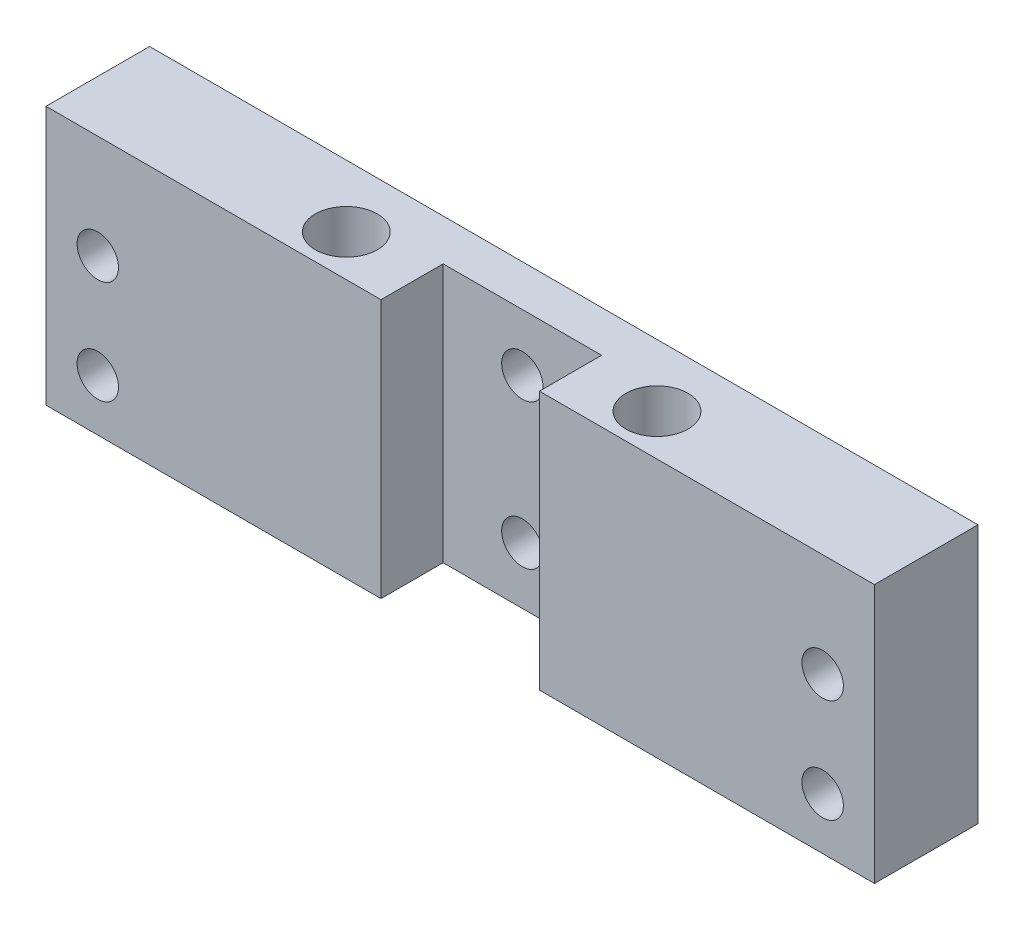
ISO-10303-21;
HEADER;
FILE_DESCRIPTION(('STEP AP214'),'2;1');
FILE_NAME('part.step','',(''),(''),'','','');
FILE_SCHEMA(('AUTOMOTIVE_DESIGN { 1 0 10303 214 1 1 1 1 }'));
ENDSEC;
DATA;
#1=APPLICATION_CONTEXT('core data for automotive mechanical design processes');
#2=APPLICATION_PROTOCOL_DEFINITION('international standard','automotive_design',2000,#1);
#3=PRODUCT_CONTEXT('',#1,'mechanical');
#4=PRODUCT('Part','Part','',(#3));
#5=PRODUCT_RELATED_PRODUCT_CATEGORY('part','',(#4));
#6=PRODUCT_DEFINITION_FORMATION('','',#4);
#7=PRODUCT_DEFINITION_CONTEXT('part definition',#1,'design');
#8=PRODUCT_DEFINITION('design','',#6,#7);
#9=PRODUCT_DEFINITION_SHAPE('','',#8);
#10=(LENGTH_UNIT() NAMED_UNIT(*) SI_UNIT(.MILLI.,.METRE.));
#11=(NAMED_UNIT(*) PLANE_ANGLE_UNIT() SI_UNIT($,.RADIAN.));
#12=(NAMED_UNIT(*) SI_UNIT($,.STERADIAN.) SOLID_ANGLE_UNIT());
#13=UNCERTAINTY_MEASURE_WITH_UNIT(LENGTH_MEASURE(1.E-05),#10,'distance_accuracy_value','');
#14=(GEOMETRIC_REPRESENTATION_CONTEXT(3) GLOBAL_UNCERTAINTY_ASSIGNED_CONTEXT((#13)) GLOBAL_UNIT_ASSIGNED_CONTEXT((#10,
#11,#12)) REPRESENTATION_CONTEXT('',''));
#15=CARTESIAN_POINT('',(0.,0.,0.));
#16=DIRECTION('',(0.,0.,1.));
#17=DIRECTION('',(1.,0.,0.));
#18=AXIS2_PLACEMENT_3D('',#15,#16,#17);
#19=CARTESIAN_POINT('',(0.,0.,10.));
#20=DIRECTION('',(0.,0.,-1.));
#21=DIRECTION('',(-1.,0.,0.));
#22=AXIS2_PLACEMENT_3D('',#19,#20,#21);
#23=PLANE('',#22);
#24=CARTESIAN_POINT('',(5.,5.,10.));
#25=DIRECTION('',(0.,0.,1.));
#26=DIRECTION('',(1.,0.,0.));
#27=AXIS2_PLACEMENT_3D('',#24,#25,#26);
#28=CIRCLE('',#27,2.);
#29=CARTESIAN_POINT('',(7.,5.,10.));
#30=VERTEX_POINT('',#29);
#31=EDGE_CURVE('E165',#30,#30,#28,.T.);
#32=ORIENTED_EDGE('',*,*,#31,.F.);
#33=EDGE_LOOP('',(#32));
#34=FACE_BOUND('',#33,.T.);
#35=CARTESIAN_POINT('',(5.,15.,10.));
#36=DIRECTION('',(0.,0.,1.));
#37=DIRECTION('',(1.,0.,0.));
#38=AXIS2_PLACEMENT_3D('',#35,#36,#37);
#39=CIRCLE('',#38,2.);
#40=CARTESIAN_POINT('',(7.,15.,10.));
#41=VERTEX_POINT('',#40);
#42=EDGE_CURVE('E171',#41,#41,#39,.T.);
#43=ORIENTED_EDGE('',*,*,#42,.F.);
#44=EDGE_LOOP('',(#43));
#45=FACE_BOUND('',#44,.T.);
#46=DIRECTION('',(1.,0.,0.));
#47=VECTOR('',#46,1.);
#48=CARTESIAN_POINT('',(0.,0.,10.));
#49=LINE('',#48,#47);
#50=CARTESIAN_POINT('',(0.,0.,10.));
#51=VERTEX_POINT('',#50);
#52=CARTESIAN_POINT('',(32.35,0.,10.));
#53=VERTEX_POINT('',#52);
#54=EDGE_CURVE('E89',#51,#53,#49,.T.);
#55=ORIENTED_EDGE('',*,*,#54,.T.);
#56=DIRECTION('',(0.,-1.,0.));
#57=VECTOR('',#56,1.);
#58=CARTESIAN_POINT('',(32.35,25.,10.));
#59=LINE('',#58,#57);
#60=CARTESIAN_POINT('',(32.35,25.,10.));
#61=VERTEX_POINT('',#60);
#62=EDGE_CURVE('E115',#61,#53,#59,.T.);
#63=ORIENTED_EDGE('',*,*,#62,.F.);
#64=DIRECTION('',(-1.,0.,0.));
#65=VECTOR('',#64,1.);
#66=CARTESIAN_POINT('',(0.,25.,10.));
#67=LINE('',#66,#65);
#68=CARTESIAN_POINT('',(0.,25.,10.));
#69=VERTEX_POINT('',#68);
#70=EDGE_CURVE('E60',#61,#69,#67,.T.);
#71=ORIENTED_EDGE('',*,*,#70,.T.);
#72=DIRECTION('',(0.,-1.,0.));
#73=VECTOR('',#72,1.);
#74=CARTESIAN_POINT('',(0.,0.,10.));
#75=LINE('',#74,#73);
#76=EDGE_CURVE('E177',#69,#51,#75,.T.);
#77=ORIENTED_EDGE('',*,*,#76,.T.);
#78=EDGE_LOOP('',(#55,#63,#71,#77));
#79=FACE_BOUND('',#78,.T.);
#80=ADVANCED_FACE('F35',(#34,#45,#79),#23,.F.);
#81=CARTESIAN_POINT('',(40.,19.5,10.));
#82=DIRECTION('',(0.,0.,-1.));
#83=DIRECTION('',(-1.,0.,0.));
#84=AXIS2_PLACEMENT_3D('',#81,#82,#83);
#85=CYLINDRICAL_SURFACE('',#84,2.);
#86=CARTESIAN_POINT('',(40.,19.5,0.));
#87=DIRECTION('',(0.,0.,1.));
#88=DIRECTION('',(1.,0.,0.));
#89=AXIS2_PLACEMENT_3D('',#86,#87,#88);
#90=CIRCLE('',#89,2.);
#91=CARTESIAN_POINT('',(42.,19.5,0.));
#92=VERTEX_POINT('',#91);
#93=EDGE_CURVE('E149',#92,#92,#90,.T.);
#94=ORIENTED_EDGE('',*,*,#93,.F.);
#95=EDGE_LOOP('',(#94));
#96=FACE_BOUND('',#95,.T.);
#97=CARTESIAN_POINT('',(40.,19.5,4.));
#98=DIRECTION('',(0.,0.,1.));
#99=DIRECTION('',(1.,0.,0.));
#100=AXIS2_PLACEMENT_3D('',#97,#98,#99);
#101=CIRCLE('',#100,2.);
#102=CARTESIAN_POINT('',(42.,19.5,4.));
#103=VERTEX_POINT('',#102);
#104=EDGE_CURVE('E143',#103,#103,#101,.T.);
#105=ORIENTED_EDGE('',*,*,#104,.T.);
#106=EDGE_LOOP('',(#105));
#107=FACE_BOUND('',#106,.T.);
#108=ADVANCED_FACE('F213',(#96,#107),#85,.F.);
#109=CARTESIAN_POINT('',(40.,5.5,10.));
#110=DIRECTION('',(0.,0.,-1.));
#111=DIRECTION('',(-1.,0.,0.));
#112=AXIS2_PLACEMENT_3D('',#109,#110,#111);
#113=CYLINDRICAL_SURFACE('',#112,2.);
#114=CARTESIAN_POINT('',(40.,5.5,0.));
#115=DIRECTION('',(0.,0.,1.));
#116=DIRECTION('',(1.,0.,0.));
#117=AXIS2_PLACEMENT_3D('',#114,#115,#116);
#118=CIRCLE('',#117,2.);
#119=CARTESIAN_POINT('',(42.,5.5,0.));
#120=VERTEX_POINT('',#119);
#121=EDGE_CURVE('E146',#120,#120,#118,.T.);
#122=ORIENTED_EDGE('',*,*,#121,.F.);
#123=EDGE_LOOP('',(#122));
#124=FACE_BOUND('',#123,.T.);
#125=CARTESIAN_POINT('',(40.,5.5,4.));
#126=DIRECTION('',(0.,0.,1.));
#127=DIRECTION('',(1.,0.,0.));
#128=AXIS2_PLACEMENT_3D('',#125,#126,#127);
#129=CIRCLE('',#128,2.);
#130=CARTESIAN_POINT('',(42.,5.5,4.));
#131=VERTEX_POINT('',#130);
#132=EDGE_CURVE('E39',#131,#131,#129,.T.);
#133=ORIENTED_EDGE('',*,*,#132,.T.);
#134=EDGE_LOOP('',(#133));
#135=FACE_BOUND('',#134,.T.);
#136=ADVANCED_FACE('F220',(#124,#135),#113,.F.);
#137=CARTESIAN_POINT('',(80.,25.,10.));
#138=VERTEX_POINT('',#137);
#139=CARTESIAN_POINT('',(47.65,25.,10.));
#140=VERTEX_POINT('',#139);
#141=EDGE_CURVE('E183',#138,#140,#67,.T.);
#142=ORIENTED_EDGE('',*,*,#141,.T.);
#143=DIRECTION('',(0.,1.,0.));
#144=VECTOR('',#143,1.);
#145=CARTESIAN_POINT('',(47.65,25.,10.));
#146=LINE('',#145,#144);
#147=CARTESIAN_POINT('',(47.65,0.,10.));
#148=VERTEX_POINT('',#147);
#149=EDGE_CURVE('E125',#148,#140,#146,.T.);
#150=ORIENTED_EDGE('',*,*,#149,.F.);
#151=CARTESIAN_POINT('',(80.,0.,10.));
#152=VERTEX_POINT('',#151);
#153=EDGE_CURVE('E179',#148,#152,#49,.T.);
#154=ORIENTED_EDGE('',*,*,#153,.T.);
#155=DIRECTION('',(0.,1.,0.));
#156=VECTOR('',#155,1.);
#157=CARTESIAN_POINT('',(80.,0.,10.));
#158=LINE('',#157,#156);
#159=EDGE_CURVE('E181',#152,#138,#158,.T.);
#160=ORIENTED_EDGE('',*,*,#159,.T.);
#161=EDGE_LOOP('',(#142,#150,#154,#160));
#162=FACE_BOUND('',#161,.T.);
#163=CARTESIAN_POINT('',(75.,15.,10.));
#164=DIRECTION('',(0.,0.,1.));
#165=DIRECTION('',(1.,0.,0.));
#166=AXIS2_PLACEMENT_3D('',#163,#164,#165);
#167=CIRCLE('',#166,2.);
#168=CARTESIAN_POINT('',(77.,15.,10.));
#169=VERTEX_POINT('',#168);
#170=EDGE_CURVE('E159',#169,#169,#167,.T.);
#171=ORIENTED_EDGE('',*,*,#170,.F.);
#172=EDGE_LOOP('',(#171));
#173=FACE_BOUND('',#172,.T.);
#174=CARTESIAN_POINT('',(75.,5.,10.));
#175=DIRECTION('',(0.,0.,1.));
#176=DIRECTION('',(1.,0.,0.));
#177=AXIS2_PLACEMENT_3D('',#174,#175,#176);
#178=CIRCLE('',#177,2.);
#179=CARTESIAN_POINT('',(77.,5.,10.));
#180=VERTEX_POINT('',#179);
#181=EDGE_CURVE('E153',#180,#180,#178,.T.);
#182=ORIENTED_EDGE('',*,*,#181,.F.);
#183=EDGE_LOOP('',(#182));
#184=FACE_BOUND('',#183,.T.);
#185=ADVANCED_FACE('F216',(#162,#173,#184),#23,.F.);
#186=CARTESIAN_POINT('',(0.,0.,0.));
#187=DIRECTION('',(0.,0.,-1.));
#188=DIRECTION('',(-1.,0.,0.));
#189=AXIS2_PLACEMENT_3D('',#186,#187,#188);
#190=PLANE('',#189);
#191=ORIENTED_EDGE('',*,*,#93,.T.);
#192=EDGE_LOOP('',(#191));
#193=FACE_BOUND('',#192,.T.);
#194=CARTESIAN_POINT('',(75.,15.,0.));
#195=DIRECTION('',(0.,0.,1.));
#196=DIRECTION('',(1.,0.,0.));
#197=AXIS2_PLACEMENT_3D('',#194,#195,#196);
#198=CIRCLE('',#197,2.);
#199=CARTESIAN_POINT('',(77.,15.,0.));
#200=VERTEX_POINT('',#199);
#201=EDGE_CURVE('E156',#200,#200,#198,.T.);
#202=ORIENTED_EDGE('',*,*,#201,.T.);
#203=EDGE_LOOP('',(#202));
#204=FACE_BOUND('',#203,.T.);
#205=CARTESIAN_POINT('',(5.,15.,0.));
#206=DIRECTION('',(0.,0.,1.));
#207=DIRECTION('',(1.,0.,0.));
#208=AXIS2_PLACEMENT_3D('',#205,#206,#207);
#209=CIRCLE('',#208,2.);
#210=CARTESIAN_POINT('',(7.,15.,0.));
#211=VERTEX_POINT('',#210);
#212=EDGE_CURVE('E168',#211,#211,#209,.T.);
#213=ORIENTED_EDGE('',*,*,#212,.T.);
#214=EDGE_LOOP('',(#213));
#215=FACE_BOUND('',#214,.T.);
#216=DIRECTION('',(0.,-1.,0.));
#217=VECTOR('',#216,1.);
#218=CARTESIAN_POINT('',(0.,0.,0.));
#219=LINE('',#218,#217);
#220=CARTESIAN_POINT('',(0.,25.,0.));
#221=VERTEX_POINT('',#220);
#222=CARTESIAN_POINT('',(0.,0.,0.));
#223=VERTEX_POINT('',#222);
#224=EDGE_CURVE('E174',#221,#223,#219,.T.);
#225=ORIENTED_EDGE('',*,*,#224,.F.);
#226=DIRECTION('',(-1.,0.,0.));
#227=VECTOR('',#226,1.);
#228=CARTESIAN_POINT('',(0.,25.,0.));
#229=LINE('',#228,#227);
#230=CARTESIAN_POINT('',(80.,25.,0.));
#231=VERTEX_POINT('',#230);
#232=EDGE_CURVE('E82',#231,#221,#229,.T.);
#233=ORIENTED_EDGE('',*,*,#232,.F.);
#234=DIRECTION('',(0.,1.,0.));
#235=VECTOR('',#234,1.);
#236=CARTESIAN_POINT('',(80.,0.,0.));
#237=LINE('',#236,#235);
#238=CARTESIAN_POINT('',(80.,0.,0.));
#239=VERTEX_POINT('',#238);
#240=EDGE_CURVE('E191',#239,#231,#237,.T.);
#241=ORIENTED_EDGE('',*,*,#240,.F.);
#242=DIRECTION('',(1.,0.,0.));
#243=VECTOR('',#242,1.);
#244=CARTESIAN_POINT('',(0.,0.,0.));
#245=LINE('',#244,#243);
#246=EDGE_CURVE('E189',#223,#239,#245,.T.);
#247=ORIENTED_EDGE('',*,*,#246,.F.);
#248=EDGE_LOOP('',(#225,#233,#241,#247));
#249=FACE_BOUND('',#248,.T.);
#250=CARTESIAN_POINT('',(5.,5.,0.));
#251=DIRECTION('',(0.,0.,1.));
#252=DIRECTION('',(1.,0.,0.));
#253=AXIS2_PLACEMENT_3D('',#250,#251,#252);
#254=CIRCLE('',#253,2.);
#255=CARTESIAN_POINT('',(7.,5.,0.));
#256=VERTEX_POINT('',#255);
#257=EDGE_CURVE('E162',#256,#256,#254,.T.);
#258=ORIENTED_EDGE('',*,*,#257,.T.);
#259=EDGE_LOOP('',(#258));
#260=FACE_BOUND('',#259,.T.);
#261=CARTESIAN_POINT('',(75.,5.,0.));
#262=DIRECTION('',(0.,0.,1.));
#263=DIRECTION('',(1.,0.,0.));
#264=AXIS2_PLACEMENT_3D('',#261,#262,#263);
#265=CIRCLE('',#264,2.);
#266=CARTESIAN_POINT('',(77.,5.,0.));
#267=VERTEX_POINT('',#266);
#268=EDGE_CURVE('E152',#267,#267,#265,.T.);
#269=ORIENTED_EDGE('',*,*,#268,.T.);
#270=EDGE_LOOP('',(#269));
#271=FACE_BOUND('',#270,.T.);
#272=ORIENTED_EDGE('',*,*,#121,.T.);
#273=EDGE_LOOP('',(#272));
#274=FACE_BOUND('',#273,.T.);
#275=ADVANCED_FACE('F206',(#193,#204,#215,#249,#260,#271,#274),#190,.T.);
#276=CARTESIAN_POINT('',(0.,0.,10.));
#277=DIRECTION('',(1.,0.,0.));
#278=DIRECTION('',(0.,0.,-1.));
#279=AXIS2_PLACEMENT_3D('',#276,#277,#278);
#280=PLANE('',#279);
#281=ORIENTED_EDGE('',*,*,#224,.T.);
#282=DIRECTION('',(0.,0.,-1.));
#283=VECTOR('',#282,1.);
#284=CARTESIAN_POINT('',(0.,0.,10.));
#285=LINE('',#284,#283);
#286=EDGE_CURVE('E11',#51,#223,#285,.T.);
#287=ORIENTED_EDGE('',*,*,#286,.F.);
#288=ORIENTED_EDGE('',*,*,#76,.F.);
#289=DIRECTION('',(0.,0.,-1.));
#290=VECTOR('',#289,1.);
#291=CARTESIAN_POINT('',(0.,25.,10.));
#292=LINE('',#291,#290);
#293=EDGE_CURVE('E186',#69,#221,#292,.T.);
#294=ORIENTED_EDGE('',*,*,#293,.T.);
#295=EDGE_LOOP('',(#281,#287,#288,#294));
#296=FACE_BOUND('',#295,.T.);
#297=ADVANCED_FACE('F37',(#296),#280,.F.);
#298=CARTESIAN_POINT('',(0.,0.,10.));
#299=DIRECTION('',(0.,1.,0.));
#300=DIRECTION('',(-1.,0.,0.));
#301=AXIS2_PLACEMENT_3D('',#298,#299,#300);
#302=PLANE('',#301);
#303=DIRECTION('',(1.,0.,0.));
#304=VECTOR('',#303,1.);
#305=CARTESIAN_POINT('',(32.35,0.,4.));
#306=LINE('',#305,#304);
#307=CARTESIAN_POINT('',(32.35,0.,4.));
#308=VERTEX_POINT('',#307);
#309=CARTESIAN_POINT('',(47.65,0.,4.));
#310=VERTEX_POINT('',#309);
#311=EDGE_CURVE('E121',#308,#310,#306,.T.);
#312=ORIENTED_EDGE('',*,*,#311,.F.);
#313=DIRECTION('',(0.,0.,1.));
#314=VECTOR('',#313,1.);
#315=CARTESIAN_POINT('',(32.35,0.,4.));
#316=LINE('',#315,#314);
#317=EDGE_CURVE('E111',#308,#53,#316,.T.);
#318=ORIENTED_EDGE('',*,*,#317,.T.);
#319=ORIENTED_EDGE('',*,*,#54,.F.);
#320=ORIENTED_EDGE('',*,*,#286,.T.);
#321=ORIENTED_EDGE('',*,*,#246,.T.);
#322=DIRECTION('',(0.,0.,-1.));
#323=VECTOR('',#322,1.);
#324=CARTESIAN_POINT('',(80.,0.,10.));
#325=LINE('',#324,#323);
#326=EDGE_CURVE('E44',#152,#239,#325,.T.);
#327=ORIENTED_EDGE('',*,*,#326,.F.);
#328=ORIENTED_EDGE('',*,*,#153,.F.);
#329=DIRECTION('',(0.,0.,1.));
#330=VECTOR('',#329,1.);
#331=CARTESIAN_POINT('',(47.65,0.,4.));
#332=LINE('',#331,#330);
#333=EDGE_CURVE('E117',#310,#148,#332,.T.);
#334=ORIENTED_EDGE('',*,*,#333,.F.);
#335=EDGE_LOOP('',(#312,#318,#319,#320,#321,#327,#328,#334));
#336=FACE_BOUND('',#335,.T.);
#337=ADVANCED_FACE('F127',(#336),#302,.F.);
#338=CARTESIAN_POINT('',(80.,0.,10.));
#339=DIRECTION('',(-1.,0.,0.));
#340=DIRECTION('',(0.,-1.,0.));
#341=AXIS2_PLACEMENT_3D('',#338,#339,#340);
#342=PLANE('',#341);
#343=ORIENTED_EDGE('',*,*,#240,.T.);
#344=DIRECTION('',(0.,0.,-1.));
#345=VECTOR('',#344,1.);
#346=CARTESIAN_POINT('',(80.,25.,10.));
#347=LINE('',#346,#345);
#348=EDGE_CURVE('E195',#138,#231,#347,.T.);
#349=ORIENTED_EDGE('',*,*,#348,.F.);
#350=ORIENTED_EDGE('',*,*,#159,.F.);
#351=ORIENTED_EDGE('',*,*,#326,.T.);
#352=EDGE_LOOP('',(#343,#349,#350,#351));
#353=FACE_BOUND('',#352,.T.);
#354=ADVANCED_FACE('F202',(#353),#342,.F.);
#355=CARTESIAN_POINT('',(0.,25.,10.));
#356=DIRECTION('',(0.,-1.,0.));
#357=DIRECTION('',(1.,0.,0.));
#358=AXIS2_PLACEMENT_3D('',#355,#356,#357);
#359=PLANE('',#358);
#360=CARTESIAN_POINT('',(25.,25.,6.));
#361=DIRECTION('',(0.,1.,0.));
#362=DIRECTION('',(-1.,0.,0.));
#363=AXIS2_PLACEMENT_3D('',#360,#361,#362);
#364=CIRCLE('',#363,2.99999999999999);
#365=CARTESIAN_POINT('',(22.,25.,6.));
#366=VERTEX_POINT('',#365);
#367=EDGE_CURVE('E416',#366,#366,#364,.T.);
#368=ORIENTED_EDGE('',*,*,#367,.F.);
#369=EDGE_LOOP('',(#368));
#370=FACE_BOUND('',#369,.T.);
#371=CARTESIAN_POINT('',(55.,25.,6.));
#372=DIRECTION('',(0.,1.,0.));
#373=DIRECTION('',(-1.,0.,0.));
#374=AXIS2_PLACEMENT_3D('',#371,#372,#373);
#375=CIRCLE('',#374,3.00000000000001);
#376=CARTESIAN_POINT('',(52.,25.,6.));
#377=VERTEX_POINT('',#376);
#378=EDGE_CURVE('E415',#377,#377,#375,.T.);
#379=ORIENTED_EDGE('',*,*,#378,.F.);
#380=EDGE_LOOP('',(#379));
#381=FACE_BOUND('',#380,.T.);
#382=ORIENTED_EDGE('',*,*,#70,.F.);
#383=DIRECTION('',(0.,0.,1.));
#384=VECTOR('',#383,1.);
#385=CARTESIAN_POINT('',(32.35,25.,4.));
#386=LINE('',#385,#384);
#387=CARTESIAN_POINT('',(32.35,25.,4.));
#388=VERTEX_POINT('',#387);
#389=EDGE_CURVE('E137',#388,#61,#386,.T.);
#390=ORIENTED_EDGE('',*,*,#389,.F.);
#391=DIRECTION('',(-1.,0.,0.));
#392=VECTOR('',#391,1.);
#393=CARTESIAN_POINT('',(32.35,25.,4.));
#394=LINE('',#393,#392);
#395=CARTESIAN_POINT('',(47.65,25.,4.));
#396=VERTEX_POINT('',#395);
#397=EDGE_CURVE('E118',#396,#388,#394,.T.);
#398=ORIENTED_EDGE('',*,*,#397,.F.);
#399=DIRECTION('',(0.,0.,1.));
#400=VECTOR('',#399,1.);
#401=CARTESIAN_POINT('',(47.65,25.,4.));
#402=LINE('',#401,#400);
#403=EDGE_CURVE('E139',#396,#140,#402,.T.);
#404=ORIENTED_EDGE('',*,*,#403,.T.);
#405=ORIENTED_EDGE('',*,*,#141,.F.);
#406=ORIENTED_EDGE('',*,*,#348,.T.);
#407=ORIENTED_EDGE('',*,*,#232,.T.);
#408=ORIENTED_EDGE('',*,*,#293,.F.);
#409=EDGE_LOOP('',(#382,#390,#398,#404,#405,#406,#407,#408));
#410=FACE_BOUND('',#409,.T.);
#411=ADVANCED_FACE('F211',(#370,#381,#410),#359,.F.);
#412=CARTESIAN_POINT('',(5.,15.,10.));
#413=DIRECTION('',(0.,0.,-1.));
#414=DIRECTION('',(-1.,0.,0.));
#415=AXIS2_PLACEMENT_3D('',#412,#413,#414);
#416=CYLINDRICAL_SURFACE('',#415,2.);
#417=ORIENTED_EDGE('',*,*,#42,.T.);
#418=EDGE_LOOP('',(#417));
#419=FACE_BOUND('',#418,.T.);
#420=ORIENTED_EDGE('',*,*,#212,.F.);
#421=EDGE_LOOP('',(#420));
#422=FACE_BOUND('',#421,.T.);
#423=ADVANCED_FACE('F280',(#419,#422),#416,.F.);
#424=CARTESIAN_POINT('',(5.,5.,10.));
#425=DIRECTION('',(0.,0.,-1.));
#426=DIRECTION('',(-1.,0.,0.));
#427=AXIS2_PLACEMENT_3D('',#424,#425,#426);
#428=CYLINDRICAL_SURFACE('',#427,2.);
#429=ORIENTED_EDGE('',*,*,#31,.T.);
#430=EDGE_LOOP('',(#429));
#431=FACE_BOUND('',#430,.T.);
#432=ORIENTED_EDGE('',*,*,#257,.F.);
#433=EDGE_LOOP('',(#432));
#434=FACE_BOUND('',#433,.T.);
#435=ADVANCED_FACE('F277',(#431,#434),#428,.F.);
#436=CARTESIAN_POINT('',(75.,15.,10.));
#437=DIRECTION('',(0.,0.,-1.));
#438=DIRECTION('',(-1.,0.,0.));
#439=AXIS2_PLACEMENT_3D('',#436,#437,#438);
#440=CYLINDRICAL_SURFACE('',#439,2.);
#441=ORIENTED_EDGE('',*,*,#170,.T.);
#442=EDGE_LOOP('',(#441));
#443=FACE_BOUND('',#442,.T.);
#444=ORIENTED_EDGE('',*,*,#201,.F.);
#445=EDGE_LOOP('',(#444));
#446=FACE_BOUND('',#445,.T.);
#447=ADVANCED_FACE('F246',(#443,#446),#440,.F.);
#448=CARTESIAN_POINT('',(75.,5.,10.));
#449=DIRECTION('',(0.,0.,-1.));
#450=DIRECTION('',(-1.,0.,0.));
#451=AXIS2_PLACEMENT_3D('',#448,#449,#450);
#452=CYLINDRICAL_SURFACE('',#451,2.);
#453=ORIENTED_EDGE('',*,*,#181,.T.);
#454=EDGE_LOOP('',(#453));
#455=FACE_BOUND('',#454,.T.);
#456=ORIENTED_EDGE('',*,*,#268,.F.);
#457=EDGE_LOOP('',(#456));
#458=FACE_BOUND('',#457,.T.);
#459=ADVANCED_FACE('F243',(#455,#458),#452,.F.);
#460=CARTESIAN_POINT('',(32.35,25.,4.));
#461=DIRECTION('',(-1.,0.,0.));
#462=DIRECTION('',(0.,0.,1.));
#463=AXIS2_PLACEMENT_3D('',#460,#461,#462);
#464=PLANE('',#463);
#465=ORIENTED_EDGE('',*,*,#62,.T.);
#466=ORIENTED_EDGE('',*,*,#317,.F.);
#467=DIRECTION('',(0.,-1.,0.));
#468=VECTOR('',#467,1.);
#469=CARTESIAN_POINT('',(32.35,25.,4.));
#470=LINE('',#469,#468);
#471=EDGE_CURVE('E114',#388,#308,#470,.T.);
#472=ORIENTED_EDGE('',*,*,#471,.F.);
#473=ORIENTED_EDGE('',*,*,#389,.T.);
#474=EDGE_LOOP('',(#465,#466,#472,#473));
#475=FACE_BOUND('',#474,.T.);
#476=ADVANCED_FACE('F113',(#475),#464,.F.);
#477=CARTESIAN_POINT('',(47.65,25.,4.));
#478=DIRECTION('',(1.,0.,0.));
#479=DIRECTION('',(0.,1.,0.));
#480=AXIS2_PLACEMENT_3D('',#477,#478,#479);
#481=PLANE('',#480);
#482=ORIENTED_EDGE('',*,*,#149,.T.);
#483=ORIENTED_EDGE('',*,*,#403,.F.);
#484=DIRECTION('',(0.,1.,0.));
#485=VECTOR('',#484,1.);
#486=CARTESIAN_POINT('',(47.65,25.,4.));
#487=LINE('',#486,#485);
#488=EDGE_CURVE('E51',#310,#396,#487,.T.);
#489=ORIENTED_EDGE('',*,*,#488,.F.);
#490=ORIENTED_EDGE('',*,*,#333,.T.);
#491=EDGE_LOOP('',(#482,#483,#489,#490));
#492=FACE_BOUND('',#491,.T.);
#493=ADVANCED_FACE('F258',(#492),#481,.F.);
#494=CARTESIAN_POINT('',(0.,0.,4.));
#495=DIRECTION('',(0.,0.,1.));
#496=DIRECTION('',(1.,0.,0.));
#497=AXIS2_PLACEMENT_3D('',#494,#495,#496);
#498=PLANE('',#497);
#499=ORIENTED_EDGE('',*,*,#104,.F.);
#500=EDGE_LOOP('',(#499));
#501=FACE_BOUND('',#500,.T.);
#502=ORIENTED_EDGE('',*,*,#132,.F.);
#503=EDGE_LOOP('',(#502));
#504=FACE_BOUND('',#503,.T.);
#505=ORIENTED_EDGE('',*,*,#471,.T.);
#506=ORIENTED_EDGE('',*,*,#311,.T.);
#507=ORIENTED_EDGE('',*,*,#488,.T.);
#508=ORIENTED_EDGE('',*,*,#397,.T.);
#509=EDGE_LOOP('',(#505,#506,#507,#508));
#510=FACE_BOUND('',#509,.T.);
#511=ADVANCED_FACE('F120',(#501,#504,#510),#498,.T.);
#512=CARTESIAN_POINT('',(55.,10.,6.));
#513=DIRECTION('',(0.,1.,0.));
#514=DIRECTION('',(-1.,0.,0.));
#515=AXIS2_PLACEMENT_3D('',#512,#513,#514);
#516=CYLINDRICAL_SURFACE('',#515,3.00000000000001);
#517=CARTESIAN_POINT('',(55.,10.,6.));
#518=DIRECTION('',(0.,1.,0.));
#519=DIRECTION('',(-1.,0.,0.));
#520=AXIS2_PLACEMENT_3D('',#517,#518,#519);
#521=CIRCLE('',#520,3.00000000000001);
#522=CARTESIAN_POINT('',(52.,10.,6.));
#523=VERTEX_POINT('',#522);
#524=EDGE_CURVE('E135',#523,#523,#521,.T.);
#525=ORIENTED_EDGE('',*,*,#524,.F.);
#526=EDGE_LOOP('',(#525));
#527=FACE_BOUND('',#526,.T.);
#528=ORIENTED_EDGE('',*,*,#378,.T.);
#529=EDGE_LOOP('',(#528));
#530=FACE_BOUND('',#529,.T.);
#531=ADVANCED_FACE('F257',(#527,#530),#516,.F.);
#532=CARTESIAN_POINT('',(55.,10.,6.));
#533=DIRECTION('',(0.,1.,0.));
#534=DIRECTION('',(-1.,0.,0.));
#535=AXIS2_PLACEMENT_3D('',#532,#533,#534);
#536=PLANE('',#535);
#537=ORIENTED_EDGE('',*,*,#524,.T.);
#538=EDGE_LOOP('',(#537));
#539=FACE_BOUND('',#538,.T.);
#540=ADVANCED_FACE('F265',(#539),#536,.T.);
#541=CARTESIAN_POINT('',(25.,10.,6.));
#542=DIRECTION('',(0.,1.,0.));
#543=DIRECTION('',(-1.,0.,0.));
#544=AXIS2_PLACEMENT_3D('',#541,#542,#543);
#545=CYLINDRICAL_SURFACE('',#544,2.99999999999999);
#546=CARTESIAN_POINT('',(25.,10.,6.));
#547=DIRECTION('',(0.,1.,0.));
#548=DIRECTION('',(-1.,0.,0.));
#549=AXIS2_PLACEMENT_3D('',#546,#547,#548);
#550=CIRCLE('',#549,2.99999999999999);
#551=CARTESIAN_POINT('',(22.,10.,6.));
#552=VERTEX_POINT('',#551);
#553=EDGE_CURVE('E414',#552,#552,#550,.T.);
#554=ORIENTED_EDGE('',*,*,#553,.F.);
#555=EDGE_LOOP('',(#554));
#556=FACE_BOUND('',#555,.T.);
#557=ORIENTED_EDGE('',*,*,#367,.T.);
#558=EDGE_LOOP('',(#557));
#559=FACE_BOUND('',#558,.T.);
#560=ADVANCED_FACE('F389',(#556,#559),#545,.F.);
#561=CARTESIAN_POINT('',(25.,10.,6.));
#562=DIRECTION('',(0.,1.,0.));
#563=DIRECTION('',(-1.,0.,0.));
#564=AXIS2_PLACEMENT_3D('',#561,#562,#563);
#565=PLANE('',#564);
#566=ORIENTED_EDGE('',*,*,#553,.T.);
#567=EDGE_LOOP('',(#566));
#568=FACE_BOUND('',#567,.T.);
#569=ADVANCED_FACE('F397',(#568),#565,.T.);
#570=CLOSED_SHELL('',(#80,#108,#136,#185,#275,#297,#337,#354,#411,#423,#435,#447,#459,#476,#493,
#511,#531,#540,#560,#569));
#571=MANIFOLD_SOLID_BREP('B2',#570);
#572=ADVANCED_BREP_SHAPE_REPRESENTATION('',(#18,#571),#14);
#573=SHAPE_DEFINITION_REPRESENTATION(#9,#572);
ENDSEC;
END-ISO-10303-21;
